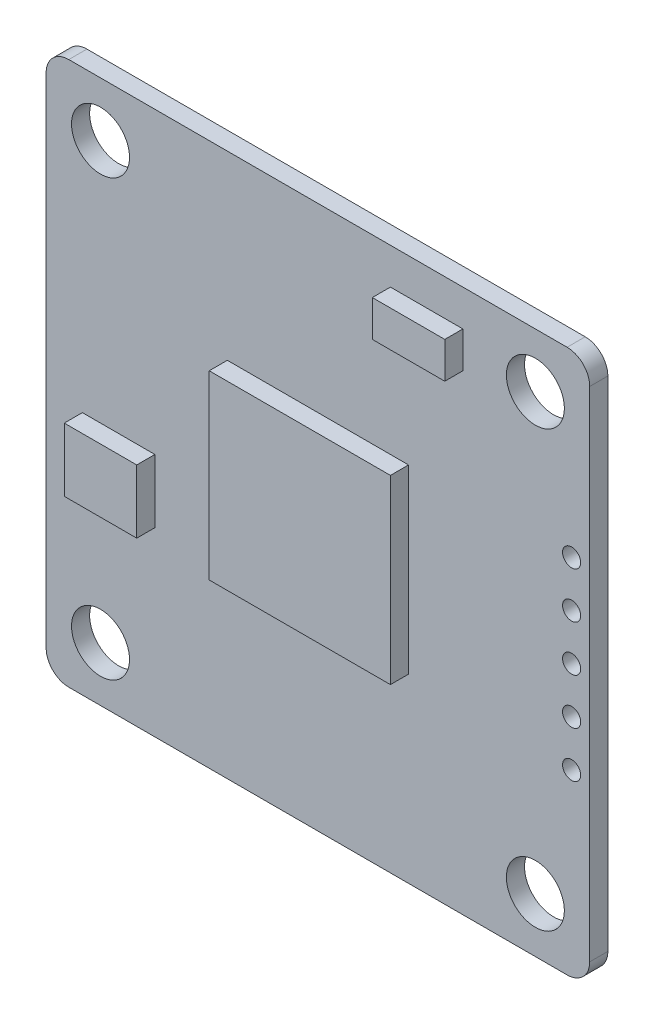
ISO-10303-21;
HEADER;
FILE_DESCRIPTION(('STEP AP214'),'2;1');
FILE_NAME('part.step','',(''),(''),'','','');
FILE_SCHEMA(('AUTOMOTIVE_DESIGN { 1 0 10303 214 1 1 1 1 }'));
ENDSEC;
DATA;
#1=APPLICATION_CONTEXT('core data for automotive mechanical design processes');
#2=APPLICATION_PROTOCOL_DEFINITION('international standard','automotive_design',2000,#1);
#3=PRODUCT_CONTEXT('',#1,'mechanical');
#4=PRODUCT('Part','Part','',(#3));
#5=PRODUCT_RELATED_PRODUCT_CATEGORY('part','',(#4));
#6=PRODUCT_DEFINITION_FORMATION('','',#4);
#7=PRODUCT_DEFINITION_CONTEXT('part definition',#1,'design');
#8=PRODUCT_DEFINITION('design','',#6,#7);
#9=PRODUCT_DEFINITION_SHAPE('','',#8);
#10=(LENGTH_UNIT() NAMED_UNIT(*) SI_UNIT(.MILLI.,.METRE.));
#11=(NAMED_UNIT(*) PLANE_ANGLE_UNIT() SI_UNIT($,.RADIAN.));
#12=(NAMED_UNIT(*) SI_UNIT($,.STERADIAN.) SOLID_ANGLE_UNIT());
#13=UNCERTAINTY_MEASURE_WITH_UNIT(LENGTH_MEASURE(1.E-05),#10,'distance_accuracy_value','');
#14=(GEOMETRIC_REPRESENTATION_CONTEXT(3) GLOBAL_UNCERTAINTY_ASSIGNED_CONTEXT((#13)) GLOBAL_UNIT_ASSIGNED_CONTEXT((#10,
#11,#12)) REPRESENTATION_CONTEXT('',''));
#15=CARTESIAN_POINT('',(0.,0.,0.));
#16=DIRECTION('',(0.,0.,1.));
#17=DIRECTION('',(1.,0.,0.));
#18=AXIS2_PLACEMENT_3D('',#15,#16,#17);
#19=CARTESIAN_POINT('',(0.,0.,1.));
#20=DIRECTION('',(0.,0.,1.));
#21=DIRECTION('',(1.,0.,0.));
#22=AXIS2_PLACEMENT_3D('',#19,#20,#21);
#23=PLANE('',#22);
#24=CARTESIAN_POINT('',(14.,-5.08,1.));
#25=DIRECTION('',(0.,0.,1.));
#26=DIRECTION('',(1.,0.,0.));
#27=AXIS2_PLACEMENT_3D('',#24,#25,#26);
#28=CIRCLE('',#27,0.500000000000001);
#29=CARTESIAN_POINT('',(14.5,-5.08,1.));
#30=VERTEX_POINT('',#29);
#31=EDGE_CURVE('E257',#30,#30,#28,.T.);
#32=ORIENTED_EDGE('',*,*,#31,.F.);
#33=EDGE_LOOP('',(#32));
#34=FACE_BOUND('',#33,.T.);
#35=CARTESIAN_POINT('',(14.,2.54,1.));
#36=DIRECTION('',(0.,0.,1.));
#37=DIRECTION('',(1.,0.,0.));
#38=AXIS2_PLACEMENT_3D('',#35,#36,#37);
#39=CIRCLE('',#38,0.500000000000001);
#40=CARTESIAN_POINT('',(14.5,2.54,1.));
#41=VERTEX_POINT('',#40);
#42=EDGE_CURVE('E263',#41,#41,#39,.T.);
#43=ORIENTED_EDGE('',*,*,#42,.F.);
#44=EDGE_LOOP('',(#43));
#45=FACE_BOUND('',#44,.T.);
#46=CARTESIAN_POINT('',(14.,5.08,1.));
#47=DIRECTION('',(0.,0.,1.));
#48=DIRECTION('',(1.,0.,0.));
#49=AXIS2_PLACEMENT_3D('',#46,#47,#48);
#50=CIRCLE('',#49,0.500000000000001);
#51=CARTESIAN_POINT('',(14.5,5.08,1.));
#52=VERTEX_POINT('',#51);
#53=EDGE_CURVE('E269',#52,#52,#50,.T.);
#54=ORIENTED_EDGE('',*,*,#53,.F.);
#55=EDGE_LOOP('',(#54));
#56=FACE_BOUND('',#55,.T.);
#57=CARTESIAN_POINT('',(14.,-2.54,1.));
#58=DIRECTION('',(0.,0.,1.));
#59=DIRECTION('',(1.,0.,0.));
#60=AXIS2_PLACEMENT_3D('',#57,#58,#59);
#61=CIRCLE('',#60,0.500000000000001);
#62=CARTESIAN_POINT('',(14.5,-2.54,1.));
#63=VERTEX_POINT('',#62);
#64=EDGE_CURVE('E278',#63,#63,#61,.T.);
#65=ORIENTED_EDGE('',*,*,#64,.F.);
#66=EDGE_LOOP('',(#65));
#67=FACE_BOUND('',#66,.T.);
#68=CARTESIAN_POINT('',(14.,0.,1.));
#69=DIRECTION('',(0.,0.,1.));
#70=DIRECTION('',(1.,0.,0.));
#71=AXIS2_PLACEMENT_3D('',#68,#69,#70);
#72=CIRCLE('',#71,0.500000000000001);
#73=CARTESIAN_POINT('',(14.5,0.,1.));
#74=VERTEX_POINT('',#73);
#75=EDGE_CURVE('E281',#74,#74,#72,.T.);
#76=ORIENTED_EDGE('',*,*,#75,.F.);
#77=EDGE_LOOP('',(#76));
#78=FACE_BOUND('',#77,.T.);
#79=CARTESIAN_POINT('',(12.,12.,1.));
#80=DIRECTION('',(0.,0.,1.));
#81=DIRECTION('',(1.,0.,0.));
#82=AXIS2_PLACEMENT_3D('',#79,#80,#81);
#83=CIRCLE('',#82,1.6);
#84=CARTESIAN_POINT('',(13.6,12.,1.));
#85=VERTEX_POINT('',#84);
#86=EDGE_CURVE('E292',#85,#85,#83,.T.);
#87=ORIENTED_EDGE('',*,*,#86,.F.);
#88=EDGE_LOOP('',(#87));
#89=FACE_BOUND('',#88,.T.);
#90=CARTESIAN_POINT('',(-12.,-11.9999999999999,1.));
#91=DIRECTION('',(0.,0.,1.));
#92=DIRECTION('',(1.,0.,0.));
#93=AXIS2_PLACEMENT_3D('',#90,#91,#92);
#94=CIRCLE('',#93,1.6);
#95=CARTESIAN_POINT('',(-10.4,-11.9999999999999,1.));
#96=VERTEX_POINT('',#95);
#97=EDGE_CURVE('E298',#96,#96,#94,.T.);
#98=ORIENTED_EDGE('',*,*,#97,.F.);
#99=EDGE_LOOP('',(#98));
#100=FACE_BOUND('',#99,.T.);
#101=CARTESIAN_POINT('',(12.,-11.9999999999999,1.));
#102=DIRECTION('',(0.,0.,1.));
#103=DIRECTION('',(1.,0.,0.));
#104=AXIS2_PLACEMENT_3D('',#101,#102,#103);
#105=CIRCLE('',#104,1.6);
#106=CARTESIAN_POINT('',(13.6,-11.9999999999999,1.));
#107=VERTEX_POINT('',#106);
#108=EDGE_CURVE('E285',#107,#107,#105,.T.);
#109=ORIENTED_EDGE('',*,*,#108,.F.);
#110=EDGE_LOOP('',(#109));
#111=FACE_BOUND('',#110,.T.);
#112=CARTESIAN_POINT('',(-12.,12.,1.));
#113=DIRECTION('',(0.,0.,1.));
#114=DIRECTION('',(1.,0.,0.));
#115=AXIS2_PLACEMENT_3D('',#112,#113,#114);
#116=CIRCLE('',#115,1.6);
#117=CARTESIAN_POINT('',(-10.4,12.,1.));
#118=VERTEX_POINT('',#117);
#119=EDGE_CURVE('E291',#118,#118,#116,.T.);
#120=ORIENTED_EDGE('',*,*,#119,.F.);
#121=EDGE_LOOP('',(#120));
#122=FACE_BOUND('',#121,.T.);
#123=DIRECTION('',(-1.,0.,0.));
#124=VECTOR('',#123,1.);
#125=CARTESIAN_POINT('',(-15.,15.,1.));
#126=LINE('',#125,#124);
#127=CARTESIAN_POINT('',(13.75,15.,1.));
#128=VERTEX_POINT('',#127);
#129=CARTESIAN_POINT('',(-13.75,15.,1.));
#130=VERTEX_POINT('',#129);
#131=EDGE_CURVE('E315',#128,#130,#126,.T.);
#132=ORIENTED_EDGE('',*,*,#131,.T.);
#133=CARTESIAN_POINT('',(-13.75,13.75,1.));
#134=DIRECTION('',(0.,0.,1.));
#135=DIRECTION('',(1.,0.,0.));
#136=AXIS2_PLACEMENT_3D('',#133,#134,#135);
#137=CIRCLE('',#136,1.25);
#138=CARTESIAN_POINT('',(-15.,13.75,1.));
#139=VERTEX_POINT('',#138);
#140=EDGE_CURVE('E359',#130,#139,#137,.T.);
#141=ORIENTED_EDGE('',*,*,#140,.T.);
#142=DIRECTION('',(0.,-1.,0.));
#143=VECTOR('',#142,1.);
#144=CARTESIAN_POINT('',(-15.,15.,1.));
#145=LINE('',#144,#143);
#146=CARTESIAN_POINT('',(-15.,-13.7499999999999,1.));
#147=VERTEX_POINT('',#146);
#148=EDGE_CURVE('E319',#139,#147,#145,.T.);
#149=ORIENTED_EDGE('',*,*,#148,.T.);
#150=CARTESIAN_POINT('',(-13.75,-13.7499999999999,1.));
#151=DIRECTION('',(0.,0.,1.));
#152=DIRECTION('',(1.,0.,0.));
#153=AXIS2_PLACEMENT_3D('',#150,#151,#152);
#154=CIRCLE('',#153,1.25);
#155=CARTESIAN_POINT('',(-13.75,-14.9999999999999,1.));
#156=VERTEX_POINT('',#155);
#157=EDGE_CURVE('E357',#147,#156,#154,.T.);
#158=ORIENTED_EDGE('',*,*,#157,.T.);
#159=DIRECTION('',(1.,0.,0.));
#160=VECTOR('',#159,1.);
#161=CARTESIAN_POINT('',(-15.,-14.9999999999999,1.));
#162=LINE('',#161,#160);
#163=CARTESIAN_POINT('',(13.75,-14.9999999999999,1.));
#164=VERTEX_POINT('',#163);
#165=EDGE_CURVE('E322',#156,#164,#162,.T.);
#166=ORIENTED_EDGE('',*,*,#165,.T.);
#167=CARTESIAN_POINT('',(13.75,-13.7499999999999,1.));
#168=DIRECTION('',(0.,0.,1.));
#169=DIRECTION('',(1.,0.,0.));
#170=AXIS2_PLACEMENT_3D('',#167,#168,#169);
#171=CIRCLE('',#170,1.25);
#172=CARTESIAN_POINT('',(15.,-13.7499999999999,1.));
#173=VERTEX_POINT('',#172);
#174=EDGE_CURVE('E355',#164,#173,#171,.T.);
#175=ORIENTED_EDGE('',*,*,#174,.T.);
#176=DIRECTION('',(0.,1.,0.));
#177=VECTOR('',#176,1.);
#178=CARTESIAN_POINT('',(15.,15.,1.));
#179=LINE('',#178,#177);
#180=CARTESIAN_POINT('',(15.,13.75,1.));
#181=VERTEX_POINT('',#180);
#182=EDGE_CURVE('E312',#173,#181,#179,.T.);
#183=ORIENTED_EDGE('',*,*,#182,.T.);
#184=CARTESIAN_POINT('',(13.75,13.75,1.));
#185=DIRECTION('',(0.,0.,1.));
#186=DIRECTION('',(1.,0.,0.));
#187=AXIS2_PLACEMENT_3D('',#184,#185,#186);
#188=CIRCLE('',#187,1.25);
#189=EDGE_CURVE('E353',#181,#128,#188,.T.);
#190=ORIENTED_EDGE('',*,*,#189,.T.);
#191=EDGE_LOOP('',(#132,#141,#149,#158,#166,#175,#183,#190));
#192=FACE_BOUND('',#191,.T.);
#193=DIRECTION('',(-1.,0.,0.));
#194=VECTOR('',#193,1.);
#195=CARTESIAN_POINT('',(-5.,5.,1.));
#196=LINE('',#195,#194);
#197=CARTESIAN_POINT('',(5.,5.,1.));
#198=VERTEX_POINT('',#197);
#199=CARTESIAN_POINT('',(-5.,5.,1.));
#200=VERTEX_POINT('',#199);
#201=EDGE_CURVE('E242',#198,#200,#196,.T.);
#202=ORIENTED_EDGE('',*,*,#201,.F.);
#203=DIRECTION('',(0.,1.,0.));
#204=VECTOR('',#203,1.);
#205=CARTESIAN_POINT('',(5.,5.,1.));
#206=LINE('',#205,#204);
#207=CARTESIAN_POINT('',(5.,-5.,1.));
#208=VERTEX_POINT('',#207);
#209=EDGE_CURVE('E228',#208,#198,#206,.T.);
#210=ORIENTED_EDGE('',*,*,#209,.F.);
#211=DIRECTION('',(1.,0.,0.));
#212=VECTOR('',#211,1.);
#213=CARTESIAN_POINT('',(-5.,-5.,1.));
#214=LINE('',#213,#212);
#215=CARTESIAN_POINT('',(-5.,-5.,1.));
#216=VERTEX_POINT('',#215);
#217=EDGE_CURVE('E233',#216,#208,#214,.T.);
#218=ORIENTED_EDGE('',*,*,#217,.F.);
#219=DIRECTION('',(0.,-1.,0.));
#220=VECTOR('',#219,1.);
#221=CARTESIAN_POINT('',(-5.,5.,1.));
#222=LINE('',#221,#220);
#223=EDGE_CURVE('E244',#200,#216,#222,.T.);
#224=ORIENTED_EDGE('',*,*,#223,.F.);
#225=EDGE_LOOP('',(#202,#210,#218,#224));
#226=FACE_BOUND('',#225,.T.);
#227=DIRECTION('',(1.,0.,0.));
#228=VECTOR('',#227,1.);
#229=CARTESIAN_POINT('',(-13.,-4.99999999999993,1.));
#230=LINE('',#229,#228);
#231=CARTESIAN_POINT('',(-13.,-4.99999999999993,1.));
#232=VERTEX_POINT('',#231);
#233=CARTESIAN_POINT('',(-8.99999999999998,-4.99999999999993,1.));
#234=VERTEX_POINT('',#233);
#235=EDGE_CURVE('E200',#232,#234,#230,.T.);
#236=ORIENTED_EDGE('',*,*,#235,.F.);
#237=DIRECTION('',(0.,-1.,0.));
#238=VECTOR('',#237,1.);
#239=CARTESIAN_POINT('',(-13.,-1.49999999999993,1.));
#240=LINE('',#239,#238);
#241=CARTESIAN_POINT('',(-13.,-1.49999999999993,1.));
#242=VERTEX_POINT('',#241);
#243=EDGE_CURVE('E197',#242,#232,#240,.T.);
#244=ORIENTED_EDGE('',*,*,#243,.F.);
#245=DIRECTION('',(-1.,0.,0.));
#246=VECTOR('',#245,1.);
#247=CARTESIAN_POINT('',(-13.,-1.49999999999993,1.));
#248=LINE('',#247,#246);
#249=CARTESIAN_POINT('',(-8.99999999999998,-1.49999999999993,1.));
#250=VERTEX_POINT('',#249);
#251=EDGE_CURVE('E209',#250,#242,#248,.T.);
#252=ORIENTED_EDGE('',*,*,#251,.F.);
#253=DIRECTION('',(0.,1.,0.));
#254=VECTOR('',#253,1.);
#255=CARTESIAN_POINT('',(-8.99999999999998,-1.49999999999993,1.));
#256=LINE('',#255,#254);
#257=EDGE_CURVE('E217',#234,#250,#256,.T.);
#258=ORIENTED_EDGE('',*,*,#257,.F.);
#259=EDGE_LOOP('',(#236,#244,#252,#258));
#260=FACE_BOUND('',#259,.T.);
#261=DIRECTION('',(1.,0.,0.));
#262=VECTOR('',#261,1.);
#263=CARTESIAN_POINT('',(4.00000000000002,11.,1.));
#264=LINE('',#263,#262);
#265=CARTESIAN_POINT('',(4.00000000000002,11.,1.));
#266=VERTEX_POINT('',#265);
#267=CARTESIAN_POINT('',(8.00000000000002,11.,1.));
#268=VERTEX_POINT('',#267);
#269=EDGE_CURVE('E701',#266,#268,#264,.T.);
#270=ORIENTED_EDGE('',*,*,#269,.F.);
#271=DIRECTION('',(0.,-1.,0.));
#272=VECTOR('',#271,1.);
#273=CARTESIAN_POINT('',(4.00000000000002,13.,1.));
#274=LINE('',#273,#272);
#275=CARTESIAN_POINT('',(4.00000000000002,13.,1.));
#276=VERTEX_POINT('',#275);
#277=EDGE_CURVE('E195',#276,#266,#274,.T.);
#278=ORIENTED_EDGE('',*,*,#277,.F.);
#279=DIRECTION('',(-1.,0.,0.));
#280=VECTOR('',#279,1.);
#281=CARTESIAN_POINT('',(4.00000000000002,13.,1.));
#282=LINE('',#281,#280);
#283=CARTESIAN_POINT('',(8.00000000000002,13.,1.));
#284=VERTEX_POINT('',#283);
#285=EDGE_CURVE('E191',#284,#276,#282,.T.);
#286=ORIENTED_EDGE('',*,*,#285,.F.);
#287=DIRECTION('',(0.,1.,0.));
#288=VECTOR('',#287,1.);
#289=CARTESIAN_POINT('',(8.00000000000002,13.,1.));
#290=LINE('',#289,#288);
#291=EDGE_CURVE('E698',#268,#284,#290,.T.);
#292=ORIENTED_EDGE('',*,*,#291,.F.);
#293=EDGE_LOOP('',(#270,#278,#286,#292));
#294=FACE_BOUND('',#293,.T.);
#295=ADVANCED_FACE('F34',(#34,#45,#56,#67,#78,#89,#100,#111,#122,#192,#226,#260,#294),#23,.T.);
#296=CARTESIAN_POINT('',(15.,15.,1.));
#297=DIRECTION('',(-1.,0.,0.));
#298=DIRECTION('',(0.,-1.,0.));
#299=AXIS2_PLACEMENT_3D('',#296,#297,#298);
#300=PLANE('',#299);
#301=ORIENTED_EDGE('',*,*,#182,.F.);
#302=DIRECTION('',(0.,0.,-1.));
#303=VECTOR('',#302,1.);
#304=CARTESIAN_POINT('',(15.,-13.7499999999999,1.));
#305=LINE('',#304,#303);
#306=CARTESIAN_POINT('',(15.,-13.7499999999999,0.));
#307=VERTEX_POINT('',#306);
#308=EDGE_CURVE('E11',#173,#307,#305,.T.);
#309=ORIENTED_EDGE('',*,*,#308,.T.);
#310=DIRECTION('',(0.,1.,0.));
#311=VECTOR('',#310,1.);
#312=CARTESIAN_POINT('',(15.,15.,0.));
#313=LINE('',#312,#311);
#314=CARTESIAN_POINT('',(15.,13.75,0.));
#315=VERTEX_POINT('',#314);
#316=EDGE_CURVE('E309',#307,#315,#313,.T.);
#317=ORIENTED_EDGE('',*,*,#316,.T.);
#318=DIRECTION('',(0.,0.,-1.));
#319=VECTOR('',#318,1.);
#320=CARTESIAN_POINT('',(15.,13.75,1.));
#321=LINE('',#320,#319);
#322=EDGE_CURVE('E42',#315,#181,#321,.F.);
#323=ORIENTED_EDGE('',*,*,#322,.T.);
#324=EDGE_LOOP('',(#301,#309,#317,#323));
#325=FACE_BOUND('',#324,.T.);
#326=ADVANCED_FACE('F368',(#325),#300,.F.);
#327=CARTESIAN_POINT('',(-15.,15.,1.));
#328=DIRECTION('',(0.,-1.,0.));
#329=DIRECTION('',(0.,0.,-1.));
#330=AXIS2_PLACEMENT_3D('',#327,#328,#329);
#331=PLANE('',#330);
#332=DIRECTION('',(-1.,0.,0.));
#333=VECTOR('',#332,1.);
#334=CARTESIAN_POINT('',(-15.,15.,0.));
#335=LINE('',#334,#333);
#336=CARTESIAN_POINT('',(13.75,15.,0.));
#337=VERTEX_POINT('',#336);
#338=CARTESIAN_POINT('',(-13.75,15.,0.));
#339=VERTEX_POINT('',#338);
#340=EDGE_CURVE('E328',#337,#339,#335,.T.);
#341=ORIENTED_EDGE('',*,*,#340,.T.);
#342=DIRECTION('',(0.,0.,-1.));
#343=VECTOR('',#342,1.);
#344=CARTESIAN_POINT('',(-13.75,15.,1.));
#345=LINE('',#344,#343);
#346=EDGE_CURVE('E351',#339,#130,#345,.F.);
#347=ORIENTED_EDGE('',*,*,#346,.T.);
#348=ORIENTED_EDGE('',*,*,#131,.F.);
#349=DIRECTION('',(0.,0.,-1.));
#350=VECTOR('',#349,1.);
#351=CARTESIAN_POINT('',(13.75,15.,1.));
#352=LINE('',#351,#350);
#353=EDGE_CURVE('E348',#128,#337,#352,.T.);
#354=ORIENTED_EDGE('',*,*,#353,.T.);
#355=EDGE_LOOP('',(#341,#347,#348,#354));
#356=FACE_BOUND('',#355,.T.);
#357=ADVANCED_FACE('F380',(#356),#331,.F.);
#358=CARTESIAN_POINT('',(-15.,15.,1.));
#359=DIRECTION('',(1.,0.,0.));
#360=DIRECTION('',(0.,1.,0.));
#361=AXIS2_PLACEMENT_3D('',#358,#359,#360);
#362=PLANE('',#361);
#363=ORIENTED_EDGE('',*,*,#148,.F.);
#364=DIRECTION('',(0.,0.,-1.));
#365=VECTOR('',#364,1.);
#366=CARTESIAN_POINT('',(-15.,13.75,1.));
#367=LINE('',#366,#365);
#368=CARTESIAN_POINT('',(-15.,13.75,0.));
#369=VERTEX_POINT('',#368);
#370=EDGE_CURVE('E337',#139,#369,#367,.T.);
#371=ORIENTED_EDGE('',*,*,#370,.T.);
#372=DIRECTION('',(0.,-1.,0.));
#373=VECTOR('',#372,1.);
#374=CARTESIAN_POINT('',(-15.,15.,0.));
#375=LINE('',#374,#373);
#376=CARTESIAN_POINT('',(-15.,-13.7499999999999,0.));
#377=VERTEX_POINT('',#376);
#378=EDGE_CURVE('E331',#369,#377,#375,.T.);
#379=ORIENTED_EDGE('',*,*,#378,.T.);
#380=DIRECTION('',(0.,0.,-1.));
#381=VECTOR('',#380,1.);
#382=CARTESIAN_POINT('',(-15.,-13.7499999999999,1.));
#383=LINE('',#382,#381);
#384=EDGE_CURVE('E325',#377,#147,#383,.F.);
#385=ORIENTED_EDGE('',*,*,#384,.T.);
#386=EDGE_LOOP('',(#363,#371,#379,#385));
#387=FACE_BOUND('',#386,.T.);
#388=ADVANCED_FACE('F391',(#387),#362,.F.);
#389=CARTESIAN_POINT('',(-15.,-14.9999999999999,1.));
#390=DIRECTION('',(0.,1.,0.));
#391=DIRECTION('',(0.,0.,1.));
#392=AXIS2_PLACEMENT_3D('',#389,#390,#391);
#393=PLANE('',#392);
#394=ORIENTED_EDGE('',*,*,#165,.F.);
#395=DIRECTION('',(0.,0.,-1.));
#396=VECTOR('',#395,1.);
#397=CARTESIAN_POINT('',(-13.75,-14.9999999999999,1.));
#398=LINE('',#397,#396);
#399=CARTESIAN_POINT('',(-13.75,-14.9999999999999,0.));
#400=VERTEX_POINT('',#399);
#401=EDGE_CURVE('E363',#156,#400,#398,.T.);
#402=ORIENTED_EDGE('',*,*,#401,.T.);
#403=DIRECTION('',(1.,0.,0.));
#404=VECTOR('',#403,1.);
#405=CARTESIAN_POINT('',(-15.,-14.9999999999999,0.));
#406=LINE('',#405,#404);
#407=CARTESIAN_POINT('',(13.75,-14.9999999999999,0.));
#408=VERTEX_POINT('',#407);
#409=EDGE_CURVE('E316',#400,#408,#406,.T.);
#410=ORIENTED_EDGE('',*,*,#409,.T.);
#411=DIRECTION('',(0.,0.,-1.));
#412=VECTOR('',#411,1.);
#413=CARTESIAN_POINT('',(13.75,-14.9999999999999,1.));
#414=LINE('',#413,#412);
#415=EDGE_CURVE('E361',#408,#164,#414,.F.);
#416=ORIENTED_EDGE('',*,*,#415,.T.);
#417=EDGE_LOOP('',(#394,#402,#410,#416));
#418=FACE_BOUND('',#417,.T.);
#419=ADVANCED_FACE('F400',(#418),#393,.F.);
#420=CARTESIAN_POINT('',(0.,0.,0.));
#421=DIRECTION('',(0.,0.,1.));
#422=DIRECTION('',(1.,0.,0.));
#423=AXIS2_PLACEMENT_3D('',#420,#421,#422);
#424=PLANE('',#423);
#425=CARTESIAN_POINT('',(14.,-5.08,0.));
#426=DIRECTION('',(0.,0.,1.));
#427=DIRECTION('',(1.,0.,0.));
#428=AXIS2_PLACEMENT_3D('',#425,#426,#427);
#429=CIRCLE('',#428,0.500000000000001);
#430=CARTESIAN_POINT('',(14.5,-5.08,0.));
#431=VERTEX_POINT('',#430);
#432=EDGE_CURVE('E260',#431,#431,#429,.T.);
#433=ORIENTED_EDGE('',*,*,#432,.T.);
#434=EDGE_LOOP('',(#433));
#435=FACE_BOUND('',#434,.T.);
#436=CARTESIAN_POINT('',(14.,2.54,0.));
#437=DIRECTION('',(0.,0.,1.));
#438=DIRECTION('',(1.,0.,0.));
#439=AXIS2_PLACEMENT_3D('',#436,#437,#438);
#440=CIRCLE('',#439,0.500000000000001);
#441=CARTESIAN_POINT('',(14.5,2.54,0.));
#442=VERTEX_POINT('',#441);
#443=EDGE_CURVE('E266',#442,#442,#440,.T.);
#444=ORIENTED_EDGE('',*,*,#443,.T.);
#445=EDGE_LOOP('',(#444));
#446=FACE_BOUND('',#445,.T.);
#447=CARTESIAN_POINT('',(14.,5.08,0.));
#448=DIRECTION('',(0.,0.,1.));
#449=DIRECTION('',(1.,0.,0.));
#450=AXIS2_PLACEMENT_3D('',#447,#448,#449);
#451=CIRCLE('',#450,0.500000000000001);
#452=CARTESIAN_POINT('',(14.5,5.08,0.));
#453=VERTEX_POINT('',#452);
#454=EDGE_CURVE('E272',#453,#453,#451,.T.);
#455=ORIENTED_EDGE('',*,*,#454,.T.);
#456=EDGE_LOOP('',(#455));
#457=FACE_BOUND('',#456,.T.);
#458=CARTESIAN_POINT('',(14.,-2.54,0.));
#459=DIRECTION('',(0.,0.,1.));
#460=DIRECTION('',(1.,0.,0.));
#461=AXIS2_PLACEMENT_3D('',#458,#459,#460);
#462=CIRCLE('',#461,0.500000000000001);
#463=CARTESIAN_POINT('',(14.5,-2.54,0.));
#464=VERTEX_POINT('',#463);
#465=EDGE_CURVE('E275',#464,#464,#462,.T.);
#466=ORIENTED_EDGE('',*,*,#465,.T.);
#467=EDGE_LOOP('',(#466));
#468=FACE_BOUND('',#467,.T.);
#469=CARTESIAN_POINT('',(14.,0.,0.));
#470=DIRECTION('',(0.,0.,1.));
#471=DIRECTION('',(1.,0.,0.));
#472=AXIS2_PLACEMENT_3D('',#469,#470,#471);
#473=CIRCLE('',#472,0.500000000000001);
#474=CARTESIAN_POINT('',(14.5,0.,0.));
#475=VERTEX_POINT('',#474);
#476=EDGE_CURVE('E282',#475,#475,#473,.T.);
#477=ORIENTED_EDGE('',*,*,#476,.T.);
#478=EDGE_LOOP('',(#477));
#479=FACE_BOUND('',#478,.T.);
#480=CARTESIAN_POINT('',(12.,12.,0.));
#481=DIRECTION('',(0.,0.,1.));
#482=DIRECTION('',(1.,0.,0.));
#483=AXIS2_PLACEMENT_3D('',#480,#481,#482);
#484=CIRCLE('',#483,1.6);
#485=CARTESIAN_POINT('',(13.6,12.,0.));
#486=VERTEX_POINT('',#485);
#487=EDGE_CURVE('E288',#486,#486,#484,.T.);
#488=ORIENTED_EDGE('',*,*,#487,.T.);
#489=EDGE_LOOP('',(#488));
#490=FACE_BOUND('',#489,.T.);
#491=CARTESIAN_POINT('',(-12.,-11.9999999999999,0.));
#492=DIRECTION('',(0.,0.,1.));
#493=DIRECTION('',(1.,0.,0.));
#494=AXIS2_PLACEMENT_3D('',#491,#492,#493);
#495=CIRCLE('',#494,1.6);
#496=CARTESIAN_POINT('',(-10.4,-11.9999999999999,0.));
#497=VERTEX_POINT('',#496);
#498=EDGE_CURVE('E295',#497,#497,#495,.T.);
#499=ORIENTED_EDGE('',*,*,#498,.T.);
#500=EDGE_LOOP('',(#499));
#501=FACE_BOUND('',#500,.T.);
#502=CARTESIAN_POINT('',(12.,-11.9999999999999,0.));
#503=DIRECTION('',(0.,0.,1.));
#504=DIRECTION('',(1.,0.,0.));
#505=AXIS2_PLACEMENT_3D('',#502,#503,#504);
#506=CIRCLE('',#505,1.6);
#507=CARTESIAN_POINT('',(13.6,-11.9999999999999,0.));
#508=VERTEX_POINT('',#507);
#509=EDGE_CURVE('E301',#508,#508,#506,.T.);
#510=ORIENTED_EDGE('',*,*,#509,.T.);
#511=EDGE_LOOP('',(#510));
#512=FACE_BOUND('',#511,.T.);
#513=CARTESIAN_POINT('',(-12.,12.,0.));
#514=DIRECTION('',(0.,0.,1.));
#515=DIRECTION('',(1.,0.,0.));
#516=AXIS2_PLACEMENT_3D('',#513,#514,#515);
#517=CIRCLE('',#516,1.6);
#518=CARTESIAN_POINT('',(-10.4,12.,0.));
#519=VERTEX_POINT('',#518);
#520=EDGE_CURVE('E306',#519,#519,#517,.T.);
#521=ORIENTED_EDGE('',*,*,#520,.T.);
#522=EDGE_LOOP('',(#521));
#523=FACE_BOUND('',#522,.T.);
#524=ORIENTED_EDGE('',*,*,#378,.F.);
#525=CARTESIAN_POINT('',(-13.75,13.75,0.));
#526=DIRECTION('',(0.,0.,1.));
#527=DIRECTION('',(1.,0.,0.));
#528=AXIS2_PLACEMENT_3D('',#525,#526,#527);
#529=CIRCLE('',#528,1.25);
#530=EDGE_CURVE('E346',#369,#339,#529,.F.);
#531=ORIENTED_EDGE('',*,*,#530,.T.);
#532=ORIENTED_EDGE('',*,*,#340,.F.);
#533=CARTESIAN_POINT('',(13.75,13.75,0.));
#534=DIRECTION('',(0.,0.,1.));
#535=DIRECTION('',(1.,0.,0.));
#536=AXIS2_PLACEMENT_3D('',#533,#534,#535);
#537=CIRCLE('',#536,1.25);
#538=EDGE_CURVE('E340',#337,#315,#537,.F.);
#539=ORIENTED_EDGE('',*,*,#538,.T.);
#540=ORIENTED_EDGE('',*,*,#316,.F.);
#541=CARTESIAN_POINT('',(13.75,-13.7499999999999,0.));
#542=DIRECTION('',(0.,0.,1.));
#543=DIRECTION('',(1.,0.,0.));
#544=AXIS2_PLACEMENT_3D('',#541,#542,#543);
#545=CIRCLE('',#544,1.25);
#546=EDGE_CURVE('E342',#307,#408,#545,.F.);
#547=ORIENTED_EDGE('',*,*,#546,.T.);
#548=ORIENTED_EDGE('',*,*,#409,.F.);
#549=CARTESIAN_POINT('',(-13.75,-13.7499999999999,0.));
#550=DIRECTION('',(0.,0.,1.));
#551=DIRECTION('',(1.,0.,0.));
#552=AXIS2_PLACEMENT_3D('',#549,#550,#551);
#553=CIRCLE('',#552,1.25);
#554=EDGE_CURVE('E344',#400,#377,#553,.F.);
#555=ORIENTED_EDGE('',*,*,#554,.T.);
#556=EDGE_LOOP('',(#524,#531,#532,#539,#540,#547,#548,#555));
#557=FACE_BOUND('',#556,.T.);
#558=ADVANCED_FACE('F384',(#435,#446,#457,#468,#479,#490,#501,#512,#523,#557),#424,.F.);
#559=CARTESIAN_POINT('',(-13.75,13.75,1.));
#560=DIRECTION('',(0.,0.,-1.));
#561=DIRECTION('',(-1.,0.,0.));
#562=AXIS2_PLACEMENT_3D('',#559,#560,#561);
#563=CYLINDRICAL_SURFACE('',#562,1.25);
#564=ORIENTED_EDGE('',*,*,#140,.F.);
#565=ORIENTED_EDGE('',*,*,#346,.F.);
#566=ORIENTED_EDGE('',*,*,#530,.F.);
#567=ORIENTED_EDGE('',*,*,#370,.F.);
#568=EDGE_LOOP('',(#564,#565,#566,#567));
#569=FACE_BOUND('',#568,.T.);
#570=ADVANCED_FACE('F388',(#569),#563,.T.);
#571=CARTESIAN_POINT('',(-13.75,-13.7499999999999,1.));
#572=DIRECTION('',(0.,0.,-1.));
#573=DIRECTION('',(-1.,0.,0.));
#574=AXIS2_PLACEMENT_3D('',#571,#572,#573);
#575=CYLINDRICAL_SURFACE('',#574,1.25);
#576=ORIENTED_EDGE('',*,*,#157,.F.);
#577=ORIENTED_EDGE('',*,*,#384,.F.);
#578=ORIENTED_EDGE('',*,*,#554,.F.);
#579=ORIENTED_EDGE('',*,*,#401,.F.);
#580=EDGE_LOOP('',(#576,#577,#578,#579));
#581=FACE_BOUND('',#580,.T.);
#582=ADVANCED_FACE('F397',(#581),#575,.T.);
#583=CARTESIAN_POINT('',(13.75,-13.7499999999999,1.));
#584=DIRECTION('',(0.,0.,-1.));
#585=DIRECTION('',(-1.,0.,0.));
#586=AXIS2_PLACEMENT_3D('',#583,#584,#585);
#587=CYLINDRICAL_SURFACE('',#586,1.25);
#588=ORIENTED_EDGE('',*,*,#174,.F.);
#589=ORIENTED_EDGE('',*,*,#415,.F.);
#590=ORIENTED_EDGE('',*,*,#546,.F.);
#591=ORIENTED_EDGE('',*,*,#308,.F.);
#592=EDGE_LOOP('',(#588,#589,#590,#591));
#593=FACE_BOUND('',#592,.T.);
#594=ADVANCED_FACE('F403',(#593),#587,.T.);
#595=CARTESIAN_POINT('',(13.75,13.75,1.));
#596=DIRECTION('',(0.,0.,-1.));
#597=DIRECTION('',(-1.,0.,0.));
#598=AXIS2_PLACEMENT_3D('',#595,#596,#597);
#599=CYLINDRICAL_SURFACE('',#598,1.25);
#600=ORIENTED_EDGE('',*,*,#189,.F.);
#601=ORIENTED_EDGE('',*,*,#322,.F.);
#602=ORIENTED_EDGE('',*,*,#538,.F.);
#603=ORIENTED_EDGE('',*,*,#353,.F.);
#604=EDGE_LOOP('',(#600,#601,#602,#603));
#605=FACE_BOUND('',#604,.T.);
#606=ADVANCED_FACE('F36',(#605),#599,.T.);
#607=CARTESIAN_POINT('',(-12.,12.,0.));
#608=DIRECTION('',(0.,0.,1.));
#609=DIRECTION('',(1.,0.,0.));
#610=AXIS2_PLACEMENT_3D('',#607,#608,#609);
#611=CYLINDRICAL_SURFACE('',#610,1.6);
#612=ORIENTED_EDGE('',*,*,#520,.F.);
#613=EDGE_LOOP('',(#612));
#614=FACE_BOUND('',#613,.T.);
#615=ORIENTED_EDGE('',*,*,#119,.T.);
#616=EDGE_LOOP('',(#615));
#617=FACE_BOUND('',#616,.T.);
#618=ADVANCED_FACE('F409',(#614,#617),#611,.F.);
#619=CARTESIAN_POINT('',(12.,-11.9999999999999,0.));
#620=DIRECTION('',(0.,0.,1.));
#621=DIRECTION('',(1.,0.,0.));
#622=AXIS2_PLACEMENT_3D('',#619,#620,#621);
#623=CYLINDRICAL_SURFACE('',#622,1.6);
#624=ORIENTED_EDGE('',*,*,#509,.F.);
#625=EDGE_LOOP('',(#624));
#626=FACE_BOUND('',#625,.T.);
#627=ORIENTED_EDGE('',*,*,#108,.T.);
#628=EDGE_LOOP('',(#627));
#629=FACE_BOUND('',#628,.T.);
#630=ADVANCED_FACE('F461',(#626,#629),#623,.F.);
#631=CARTESIAN_POINT('',(-12.,-11.9999999999999,0.));
#632=DIRECTION('',(0.,0.,1.));
#633=DIRECTION('',(1.,0.,0.));
#634=AXIS2_PLACEMENT_3D('',#631,#632,#633);
#635=CYLINDRICAL_SURFACE('',#634,1.6);
#636=ORIENTED_EDGE('',*,*,#498,.F.);
#637=EDGE_LOOP('',(#636));
#638=FACE_BOUND('',#637,.T.);
#639=ORIENTED_EDGE('',*,*,#97,.T.);
#640=EDGE_LOOP('',(#639));
#641=FACE_BOUND('',#640,.T.);
#642=ADVANCED_FACE('F470',(#638,#641),#635,.F.);
#643=CARTESIAN_POINT('',(12.,12.,0.));
#644=DIRECTION('',(0.,0.,1.));
#645=DIRECTION('',(1.,0.,0.));
#646=AXIS2_PLACEMENT_3D('',#643,#644,#645);
#647=CYLINDRICAL_SURFACE('',#646,1.6);
#648=ORIENTED_EDGE('',*,*,#487,.F.);
#649=EDGE_LOOP('',(#648));
#650=FACE_BOUND('',#649,.T.);
#651=ORIENTED_EDGE('',*,*,#86,.T.);
#652=EDGE_LOOP('',(#651));
#653=FACE_BOUND('',#652,.T.);
#654=ADVANCED_FACE('F479',(#650,#653),#647,.F.);
#655=CARTESIAN_POINT('',(14.,0.,0.));
#656=DIRECTION('',(0.,0.,1.));
#657=DIRECTION('',(1.,0.,0.));
#658=AXIS2_PLACEMENT_3D('',#655,#656,#657);
#659=CYLINDRICAL_SURFACE('',#658,0.500000000000001);
#660=ORIENTED_EDGE('',*,*,#476,.F.);
#661=EDGE_LOOP('',(#660));
#662=FACE_BOUND('',#661,.T.);
#663=ORIENTED_EDGE('',*,*,#75,.T.);
#664=EDGE_LOOP('',(#663));
#665=FACE_BOUND('',#664,.T.);
#666=ADVANCED_FACE('F489',(#662,#665),#659,.F.);
#667=CARTESIAN_POINT('',(14.,-2.54,0.));
#668=DIRECTION('',(0.,0.,1.));
#669=DIRECTION('',(1.,0.,0.));
#670=AXIS2_PLACEMENT_3D('',#667,#668,#669);
#671=CYLINDRICAL_SURFACE('',#670,0.500000000000001);
#672=ORIENTED_EDGE('',*,*,#465,.F.);
#673=EDGE_LOOP('',(#672));
#674=FACE_BOUND('',#673,.T.);
#675=ORIENTED_EDGE('',*,*,#64,.T.);
#676=EDGE_LOOP('',(#675));
#677=FACE_BOUND('',#676,.T.);
#678=ADVANCED_FACE('F498',(#674,#677),#671,.F.);
#679=CARTESIAN_POINT('',(14.,5.08,0.));
#680=DIRECTION('',(0.,0.,1.));
#681=DIRECTION('',(1.,0.,0.));
#682=AXIS2_PLACEMENT_3D('',#679,#680,#681);
#683=CYLINDRICAL_SURFACE('',#682,0.500000000000001);
#684=ORIENTED_EDGE('',*,*,#454,.F.);
#685=EDGE_LOOP('',(#684));
#686=FACE_BOUND('',#685,.T.);
#687=ORIENTED_EDGE('',*,*,#53,.T.);
#688=EDGE_LOOP('',(#687));
#689=FACE_BOUND('',#688,.T.);
#690=ADVANCED_FACE('F514',(#686,#689),#683,.F.);
#691=CARTESIAN_POINT('',(14.,2.54,0.));
#692=DIRECTION('',(0.,0.,1.));
#693=DIRECTION('',(1.,0.,0.));
#694=AXIS2_PLACEMENT_3D('',#691,#692,#693);
#695=CYLINDRICAL_SURFACE('',#694,0.500000000000001);
#696=ORIENTED_EDGE('',*,*,#443,.F.);
#697=EDGE_LOOP('',(#696));
#698=FACE_BOUND('',#697,.T.);
#699=ORIENTED_EDGE('',*,*,#42,.T.);
#700=EDGE_LOOP('',(#699));
#701=FACE_BOUND('',#700,.T.);
#702=ADVANCED_FACE('F524',(#698,#701),#695,.F.);
#703=CARTESIAN_POINT('',(14.,-5.08,0.));
#704=DIRECTION('',(0.,0.,1.));
#705=DIRECTION('',(1.,0.,0.));
#706=AXIS2_PLACEMENT_3D('',#703,#704,#705);
#707=CYLINDRICAL_SURFACE('',#706,0.500000000000001);
#708=ORIENTED_EDGE('',*,*,#432,.F.);
#709=EDGE_LOOP('',(#708));
#710=FACE_BOUND('',#709,.T.);
#711=ORIENTED_EDGE('',*,*,#31,.T.);
#712=EDGE_LOOP('',(#711));
#713=FACE_BOUND('',#712,.T.);
#714=ADVANCED_FACE('F534',(#710,#713),#707,.F.);
#715=CARTESIAN_POINT('',(5.,5.,2.));
#716=DIRECTION('',(-1.,0.,0.));
#717=DIRECTION('',(0.,-1.,0.));
#718=AXIS2_PLACEMENT_3D('',#715,#716,#717);
#719=PLANE('',#718);
#720=ORIENTED_EDGE('',*,*,#209,.T.);
#721=DIRECTION('',(0.,0.,-1.));
#722=VECTOR('',#721,1.);
#723=CARTESIAN_POINT('',(5.,5.,2.));
#724=LINE('',#723,#722);
#725=CARTESIAN_POINT('',(5.,5.,2.));
#726=VERTEX_POINT('',#725);
#727=EDGE_CURVE('E255',#726,#198,#724,.T.);
#728=ORIENTED_EDGE('',*,*,#727,.F.);
#729=DIRECTION('',(0.,1.,0.));
#730=VECTOR('',#729,1.);
#731=CARTESIAN_POINT('',(5.,5.,2.));
#732=LINE('',#731,#730);
#733=CARTESIAN_POINT('',(5.,-5.,2.));
#734=VERTEX_POINT('',#733);
#735=EDGE_CURVE('E229',#734,#726,#732,.T.);
#736=ORIENTED_EDGE('',*,*,#735,.F.);
#737=DIRECTION('',(0.,0.,-1.));
#738=VECTOR('',#737,1.);
#739=CARTESIAN_POINT('',(5.,-5.,2.));
#740=LINE('',#739,#738);
#741=EDGE_CURVE('E239',#734,#208,#740,.T.);
#742=ORIENTED_EDGE('',*,*,#741,.T.);
#743=EDGE_LOOP('',(#720,#728,#736,#742));
#744=FACE_BOUND('',#743,.T.);
#745=ADVANCED_FACE('F544',(#744),#719,.F.);
#746=CARTESIAN_POINT('',(-5.,5.,2.));
#747=DIRECTION('',(0.,-1.,0.));
#748=DIRECTION('',(0.,0.,-1.));
#749=AXIS2_PLACEMENT_3D('',#746,#747,#748);
#750=PLANE('',#749);
#751=ORIENTED_EDGE('',*,*,#201,.T.);
#752=DIRECTION('',(0.,0.,-1.));
#753=VECTOR('',#752,1.);
#754=CARTESIAN_POINT('',(-5.,5.,2.));
#755=LINE('',#754,#753);
#756=CARTESIAN_POINT('',(-5.,5.,2.));
#757=VERTEX_POINT('',#756);
#758=EDGE_CURVE('E252',#757,#200,#755,.T.);
#759=ORIENTED_EDGE('',*,*,#758,.F.);
#760=DIRECTION('',(-1.,0.,0.));
#761=VECTOR('',#760,1.);
#762=CARTESIAN_POINT('',(-5.,5.,2.));
#763=LINE('',#762,#761);
#764=EDGE_CURVE('E232',#726,#757,#763,.T.);
#765=ORIENTED_EDGE('',*,*,#764,.F.);
#766=ORIENTED_EDGE('',*,*,#727,.T.);
#767=EDGE_LOOP('',(#751,#759,#765,#766));
#768=FACE_BOUND('',#767,.T.);
#769=ADVANCED_FACE('F554',(#768),#750,.F.);
#770=CARTESIAN_POINT('',(-5.,5.,2.));
#771=DIRECTION('',(1.,0.,0.));
#772=DIRECTION('',(0.,1.,0.));
#773=AXIS2_PLACEMENT_3D('',#770,#771,#772);
#774=PLANE('',#773);
#775=ORIENTED_EDGE('',*,*,#223,.T.);
#776=DIRECTION('',(0.,0.,-1.));
#777=VECTOR('',#776,1.);
#778=CARTESIAN_POINT('',(-5.,-5.,2.));
#779=LINE('',#778,#777);
#780=CARTESIAN_POINT('',(-5.,-5.,2.));
#781=VERTEX_POINT('',#780);
#782=EDGE_CURVE('E250',#781,#216,#779,.T.);
#783=ORIENTED_EDGE('',*,*,#782,.F.);
#784=DIRECTION('',(0.,-1.,0.));
#785=VECTOR('',#784,1.);
#786=CARTESIAN_POINT('',(-5.,5.,2.));
#787=LINE('',#786,#785);
#788=EDGE_CURVE('E235',#757,#781,#787,.T.);
#789=ORIENTED_EDGE('',*,*,#788,.F.);
#790=ORIENTED_EDGE('',*,*,#758,.T.);
#791=EDGE_LOOP('',(#775,#783,#789,#790));
#792=FACE_BOUND('',#791,.T.);
#793=ADVANCED_FACE('F564',(#792),#774,.F.);
#794=CARTESIAN_POINT('',(-5.,-5.,2.));
#795=DIRECTION('',(0.,1.,0.));
#796=DIRECTION('',(0.,0.,1.));
#797=AXIS2_PLACEMENT_3D('',#794,#795,#796);
#798=PLANE('',#797);
#799=ORIENTED_EDGE('',*,*,#217,.T.);
#800=ORIENTED_EDGE('',*,*,#741,.F.);
#801=DIRECTION('',(1.,0.,0.));
#802=VECTOR('',#801,1.);
#803=CARTESIAN_POINT('',(-5.,-5.,2.));
#804=LINE('',#803,#802);
#805=EDGE_CURVE('E237',#781,#734,#804,.T.);
#806=ORIENTED_EDGE('',*,*,#805,.F.);
#807=ORIENTED_EDGE('',*,*,#782,.T.);
#808=EDGE_LOOP('',(#799,#800,#806,#807));
#809=FACE_BOUND('',#808,.T.);
#810=ADVANCED_FACE('F574',(#809),#798,.F.);
#811=CARTESIAN_POINT('',(0.,0.,2.));
#812=DIRECTION('',(0.,0.,1.));
#813=DIRECTION('',(1.,0.,0.));
#814=AXIS2_PLACEMENT_3D('',#811,#812,#813);
#815=PLANE('',#814);
#816=ORIENTED_EDGE('',*,*,#735,.T.);
#817=ORIENTED_EDGE('',*,*,#764,.T.);
#818=ORIENTED_EDGE('',*,*,#788,.T.);
#819=ORIENTED_EDGE('',*,*,#805,.T.);
#820=EDGE_LOOP('',(#816,#817,#818,#819));
#821=FACE_BOUND('',#820,.T.);
#822=ADVANCED_FACE('F584',(#821),#815,.T.);
#823=CARTESIAN_POINT('',(-13.,-1.49999999999993,2.));
#824=DIRECTION('',(1.,0.,0.));
#825=DIRECTION('',(0.,0.,-1.));
#826=AXIS2_PLACEMENT_3D('',#823,#824,#825);
#827=PLANE('',#826);
#828=ORIENTED_EDGE('',*,*,#243,.T.);
#829=DIRECTION('',(0.,0.,-1.));
#830=VECTOR('',#829,1.);
#831=CARTESIAN_POINT('',(-13.,-4.99999999999993,2.));
#832=LINE('',#831,#830);
#833=CARTESIAN_POINT('',(-13.,-4.99999999999993,2.));
#834=VERTEX_POINT('',#833);
#835=EDGE_CURVE('E226',#834,#232,#832,.T.);
#836=ORIENTED_EDGE('',*,*,#835,.F.);
#837=DIRECTION('',(0.,-1.,0.));
#838=VECTOR('',#837,1.);
#839=CARTESIAN_POINT('',(-13.,-1.49999999999993,2.));
#840=LINE('',#839,#838);
#841=CARTESIAN_POINT('',(-13.,-1.49999999999993,2.));
#842=VERTEX_POINT('',#841);
#843=EDGE_CURVE('E205',#842,#834,#840,.T.);
#844=ORIENTED_EDGE('',*,*,#843,.F.);
#845=DIRECTION('',(0.,0.,-1.));
#846=VECTOR('',#845,1.);
#847=CARTESIAN_POINT('',(-13.,-1.49999999999993,2.));
#848=LINE('',#847,#846);
#849=EDGE_CURVE('E214',#842,#242,#848,.T.);
#850=ORIENTED_EDGE('',*,*,#849,.T.);
#851=EDGE_LOOP('',(#828,#836,#844,#850));
#852=FACE_BOUND('',#851,.T.);
#853=ADVANCED_FACE('F593',(#852),#827,.F.);
#854=CARTESIAN_POINT('',(-13.,-4.99999999999993,2.));
#855=DIRECTION('',(0.,1.,0.));
#856=DIRECTION('',(0.,0.,1.));
#857=AXIS2_PLACEMENT_3D('',#854,#855,#856);
#858=PLANE('',#857);
#859=ORIENTED_EDGE('',*,*,#235,.T.);
#860=DIRECTION('',(0.,0.,-1.));
#861=VECTOR('',#860,1.);
#862=CARTESIAN_POINT('',(-8.99999999999998,-4.99999999999993,2.));
#863=LINE('',#862,#861);
#864=CARTESIAN_POINT('',(-8.99999999999998,-4.99999999999993,2.));
#865=VERTEX_POINT('',#864);
#866=EDGE_CURVE('E223',#865,#234,#863,.T.);
#867=ORIENTED_EDGE('',*,*,#866,.F.);
#868=DIRECTION('',(1.,0.,0.));
#869=VECTOR('',#868,1.);
#870=CARTESIAN_POINT('',(-13.,-4.99999999999993,2.));
#871=LINE('',#870,#869);
#872=EDGE_CURVE('E208',#834,#865,#871,.T.);
#873=ORIENTED_EDGE('',*,*,#872,.F.);
#874=ORIENTED_EDGE('',*,*,#835,.T.);
#875=EDGE_LOOP('',(#859,#867,#873,#874));
#876=FACE_BOUND('',#875,.T.);
#877=ADVANCED_FACE('F608',(#876),#858,.F.);
#878=CARTESIAN_POINT('',(-8.99999999999998,-1.49999999999993,2.));
#879=DIRECTION('',(-1.,0.,0.));
#880=DIRECTION('',(0.,0.,1.));
#881=AXIS2_PLACEMENT_3D('',#878,#879,#880);
#882=PLANE('',#881);
#883=ORIENTED_EDGE('',*,*,#257,.T.);
#884=DIRECTION('',(0.,0.,-1.));
#885=VECTOR('',#884,1.);
#886=CARTESIAN_POINT('',(-8.99999999999998,-1.49999999999993,2.));
#887=LINE('',#886,#885);
#888=CARTESIAN_POINT('',(-8.99999999999998,-1.49999999999993,2.));
#889=VERTEX_POINT('',#888);
#890=EDGE_CURVE('E57',#889,#250,#887,.T.);
#891=ORIENTED_EDGE('',*,*,#890,.F.);
#892=DIRECTION('',(0.,1.,0.));
#893=VECTOR('',#892,1.);
#894=CARTESIAN_POINT('',(-8.99999999999998,-1.49999999999993,2.));
#895=LINE('',#894,#893);
#896=EDGE_CURVE('E211',#865,#889,#895,.T.);
#897=ORIENTED_EDGE('',*,*,#896,.F.);
#898=ORIENTED_EDGE('',*,*,#866,.T.);
#899=EDGE_LOOP('',(#883,#891,#897,#898));
#900=FACE_BOUND('',#899,.T.);
#901=ADVANCED_FACE('F618',(#900),#882,.F.);
#902=CARTESIAN_POINT('',(-13.,-1.49999999999993,2.));
#903=DIRECTION('',(0.,-1.,0.));
#904=DIRECTION('',(0.,0.,-1.));
#905=AXIS2_PLACEMENT_3D('',#902,#903,#904);
#906=PLANE('',#905);
#907=ORIENTED_EDGE('',*,*,#251,.T.);
#908=ORIENTED_EDGE('',*,*,#849,.F.);
#909=DIRECTION('',(-1.,0.,0.));
#910=VECTOR('',#909,1.);
#911=CARTESIAN_POINT('',(-13.,-1.49999999999993,2.));
#912=LINE('',#911,#910);
#913=EDGE_CURVE('E213',#889,#842,#912,.T.);
#914=ORIENTED_EDGE('',*,*,#913,.F.);
#915=ORIENTED_EDGE('',*,*,#890,.T.);
#916=EDGE_LOOP('',(#907,#908,#914,#915));
#917=FACE_BOUND('',#916,.T.);
#918=ADVANCED_FACE('F628',(#917),#906,.F.);
#919=CARTESIAN_POINT('',(0.,0.,2.));
#920=DIRECTION('',(0.,0.,1.));
#921=DIRECTION('',(1.,0.,0.));
#922=AXIS2_PLACEMENT_3D('',#919,#920,#921);
#923=PLANE('',#922);
#924=ORIENTED_EDGE('',*,*,#843,.T.);
#925=ORIENTED_EDGE('',*,*,#872,.T.);
#926=ORIENTED_EDGE('',*,*,#896,.T.);
#927=ORIENTED_EDGE('',*,*,#913,.T.);
#928=EDGE_LOOP('',(#924,#925,#926,#927));
#929=FACE_BOUND('',#928,.T.);
#930=ADVANCED_FACE('F638',(#929),#923,.T.);
#931=CARTESIAN_POINT('',(4.00000000000002,13.,2.));
#932=DIRECTION('',(1.,0.,0.));
#933=DIRECTION('',(0.,0.,-1.));
#934=AXIS2_PLACEMENT_3D('',#931,#932,#933);
#935=PLANE('',#934);
#936=ORIENTED_EDGE('',*,*,#277,.T.);
#937=DIRECTION('',(0.,0.,-1.));
#938=VECTOR('',#937,1.);
#939=CARTESIAN_POINT('',(4.00000000000002,11.,2.));
#940=LINE('',#939,#938);
#941=CARTESIAN_POINT('',(4.00000000000002,11.,2.));
#942=VERTEX_POINT('',#941);
#943=EDGE_CURVE('E176',#942,#266,#940,.T.);
#944=ORIENTED_EDGE('',*,*,#943,.F.);
#945=DIRECTION('',(0.,-1.,0.));
#946=VECTOR('',#945,1.);
#947=CARTESIAN_POINT('',(4.00000000000002,13.,2.));
#948=LINE('',#947,#946);
#949=CARTESIAN_POINT('',(4.00000000000002,13.,2.));
#950=VERTEX_POINT('',#949);
#951=EDGE_CURVE('E183',#950,#942,#948,.T.);
#952=ORIENTED_EDGE('',*,*,#951,.F.);
#953=DIRECTION('',(0.,0.,-1.));
#954=VECTOR('',#953,1.);
#955=CARTESIAN_POINT('',(4.00000000000002,13.,2.));
#956=LINE('',#955,#954);
#957=EDGE_CURVE('E695',#950,#276,#956,.T.);
#958=ORIENTED_EDGE('',*,*,#957,.T.);
#959=EDGE_LOOP('',(#936,#944,#952,#958));
#960=FACE_BOUND('',#959,.T.);
#961=ADVANCED_FACE('F193',(#960),#935,.F.);
#962=CARTESIAN_POINT('',(4.00000000000002,11.,2.));
#963=DIRECTION('',(0.,1.,0.));
#964=DIRECTION('',(0.,0.,1.));
#965=AXIS2_PLACEMENT_3D('',#962,#963,#964);
#966=PLANE('',#965);
#967=ORIENTED_EDGE('',*,*,#269,.T.);
#968=DIRECTION('',(0.,0.,-1.));
#969=VECTOR('',#968,1.);
#970=CARTESIAN_POINT('',(8.00000000000002,11.,2.));
#971=LINE('',#970,#969);
#972=CARTESIAN_POINT('',(8.00000000000002,11.,2.));
#973=VERTEX_POINT('',#972);
#974=EDGE_CURVE('E179',#973,#268,#971,.T.);
#975=ORIENTED_EDGE('',*,*,#974,.F.);
#976=DIRECTION('',(1.,0.,0.));
#977=VECTOR('',#976,1.);
#978=CARTESIAN_POINT('',(4.00000000000002,11.,2.));
#979=LINE('',#978,#977);
#980=EDGE_CURVE('E172',#942,#973,#979,.T.);
#981=ORIENTED_EDGE('',*,*,#980,.F.);
#982=ORIENTED_EDGE('',*,*,#943,.T.);
#983=EDGE_LOOP('',(#967,#975,#981,#982));
#984=FACE_BOUND('',#983,.T.);
#985=ADVANCED_FACE('F174',(#984),#966,.F.);
#986=CARTESIAN_POINT('',(8.00000000000002,13.,2.));
#987=DIRECTION('',(-1.,0.,0.));
#988=DIRECTION('',(0.,0.,1.));
#989=AXIS2_PLACEMENT_3D('',#986,#987,#988);
#990=PLANE('',#989);
#991=ORIENTED_EDGE('',*,*,#291,.T.);
#992=DIRECTION('',(0.,0.,-1.));
#993=VECTOR('',#992,1.);
#994=CARTESIAN_POINT('',(8.00000000000002,13.,2.));
#995=LINE('',#994,#993);
#996=CARTESIAN_POINT('',(8.00000000000002,13.,2.));
#997=VERTEX_POINT('',#996);
#998=EDGE_CURVE('E49',#997,#284,#995,.T.);
#999=ORIENTED_EDGE('',*,*,#998,.F.);
#1000=DIRECTION('',(0.,1.,0.));
#1001=VECTOR('',#1000,1.);
#1002=CARTESIAN_POINT('',(8.00000000000002,13.,2.));
#1003=LINE('',#1002,#1001);
#1004=EDGE_CURVE('E182',#973,#997,#1003,.T.);
#1005=ORIENTED_EDGE('',*,*,#1004,.F.);
#1006=ORIENTED_EDGE('',*,*,#974,.T.);
#1007=EDGE_LOOP('',(#991,#999,#1005,#1006));
#1008=FACE_BOUND('',#1007,.T.);
#1009=ADVANCED_FACE('F664',(#1008),#990,.F.);
#1010=CARTESIAN_POINT('',(4.00000000000002,13.,2.));
#1011=DIRECTION('',(0.,-1.,0.));
#1012=DIRECTION('',(0.,0.,-1.));
#1013=AXIS2_PLACEMENT_3D('',#1010,#1011,#1012);
#1014=PLANE('',#1013);
#1015=ORIENTED_EDGE('',*,*,#285,.T.);
#1016=ORIENTED_EDGE('',*,*,#957,.F.);
#1017=DIRECTION('',(-1.,0.,0.));
#1018=VECTOR('',#1017,1.);
#1019=CARTESIAN_POINT('',(4.00000000000002,13.,2.));
#1020=LINE('',#1019,#1018);
#1021=EDGE_CURVE('E187',#997,#950,#1020,.T.);
#1022=ORIENTED_EDGE('',*,*,#1021,.F.);
#1023=ORIENTED_EDGE('',*,*,#998,.T.);
#1024=EDGE_LOOP('',(#1015,#1016,#1022,#1023));
#1025=FACE_BOUND('',#1024,.T.);
#1026=ADVANCED_FACE('F673',(#1025),#1014,.F.);
#1027=CARTESIAN_POINT('',(0.,0.,2.));
#1028=DIRECTION('',(0.,0.,1.));
#1029=DIRECTION('',(1.,0.,0.));
#1030=AXIS2_PLACEMENT_3D('',#1027,#1028,#1029);
#1031=PLANE('',#1030);
#1032=ORIENTED_EDGE('',*,*,#951,.T.);
#1033=ORIENTED_EDGE('',*,*,#980,.T.);
#1034=ORIENTED_EDGE('',*,*,#1004,.T.);
#1035=ORIENTED_EDGE('',*,*,#1021,.T.);
#1036=EDGE_LOOP('',(#1032,#1033,#1034,#1035));
#1037=FACE_BOUND('',#1036,.T.);
#1038=ADVANCED_FACE('F186',(#1037),#1031,.T.);
#1039=CLOSED_SHELL('',(#295,#326,#357,#388,#419,#558,#570,#582,#594,#606,#618,#630,#642,#654,
#666,#678,#690,#702,#714,#745,#769,#793,#810,#822,#853,#877,#901,#918,#930,#961,#985,#1009,
#1026,#1038));
#1040=MANIFOLD_SOLID_BREP('B2',#1039);
#1041=ADVANCED_BREP_SHAPE_REPRESENTATION('',(#18,#1040),#14);
#1042=SHAPE_DEFINITION_REPRESENTATION(#9,#1041);
ENDSEC;
END-ISO-10303-21;
